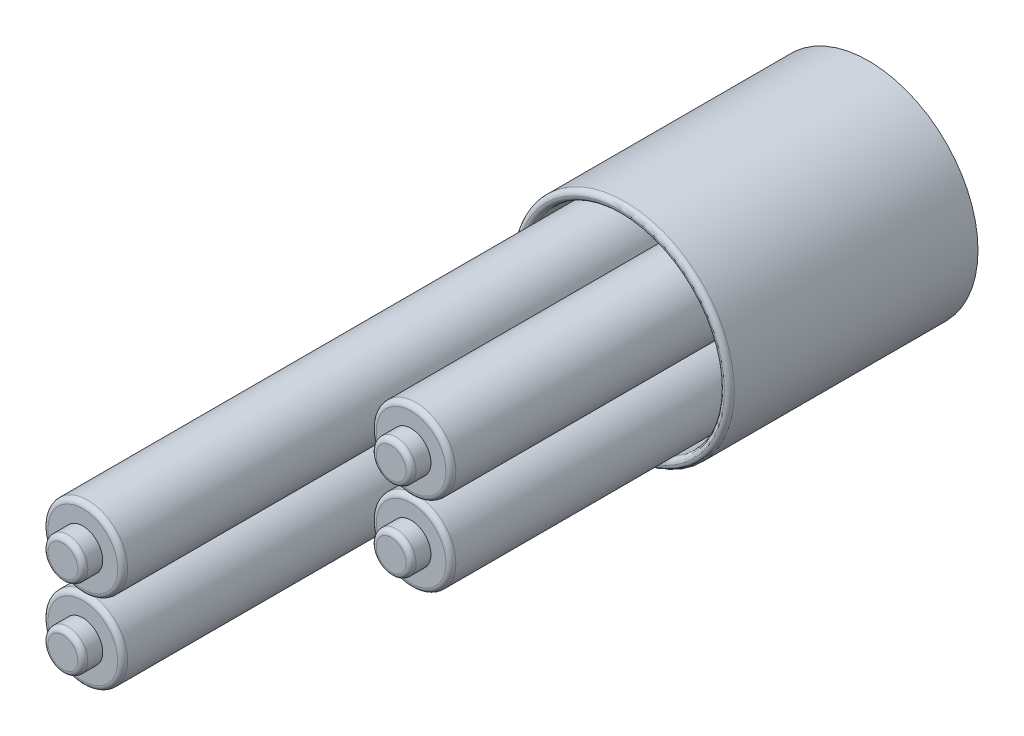
ISO-10303-21;
HEADER;
FILE_DESCRIPTION(('STEP AP214'),'2;1');
FILE_NAME('part.step','',(''),(''),'','','');
FILE_SCHEMA(('AUTOMOTIVE_DESIGN { 1 0 10303 214 1 1 1 1 }'));
ENDSEC;
DATA;
#1=APPLICATION_CONTEXT('core data for automotive mechanical design processes');
#2=APPLICATION_PROTOCOL_DEFINITION('international standard','automotive_design',2000,#1);
#3=PRODUCT_CONTEXT('',#1,'mechanical');
#4=PRODUCT('Part','Part','',(#3));
#5=PRODUCT_RELATED_PRODUCT_CATEGORY('part','',(#4));
#6=PRODUCT_DEFINITION_FORMATION('','',#4);
#7=PRODUCT_DEFINITION_CONTEXT('part definition',#1,'design');
#8=PRODUCT_DEFINITION('design','',#6,#7);
#9=PRODUCT_DEFINITION_SHAPE('','',#8);
#10=(LENGTH_UNIT() NAMED_UNIT(*) SI_UNIT(.MILLI.,.METRE.));
#11=(NAMED_UNIT(*) PLANE_ANGLE_UNIT() SI_UNIT($,.RADIAN.));
#12=(NAMED_UNIT(*) SI_UNIT($,.STERADIAN.) SOLID_ANGLE_UNIT());
#13=UNCERTAINTY_MEASURE_WITH_UNIT(LENGTH_MEASURE(1.E-05),#10,'distance_accuracy_value','');
#14=(GEOMETRIC_REPRESENTATION_CONTEXT(3) GLOBAL_UNCERTAINTY_ASSIGNED_CONTEXT((#13)) GLOBAL_UNIT_ASSIGNED_CONTEXT((#10,
#11,#12)) REPRESENTATION_CONTEXT('',''));
#15=CARTESIAN_POINT('',(0.,0.,0.));
#16=DIRECTION('',(0.,0.,1.));
#17=DIRECTION('',(1.,0.,0.));
#18=AXIS2_PLACEMENT_3D('',#15,#16,#17);
#19=CARTESIAN_POINT('',(-0.1016,0.1016,1.9558));
#20=DIRECTION('',(0.,0.,-1.));
#21=DIRECTION('',(-1.,0.,0.));
#22=AXIS2_PLACEMENT_3D('',#19,#20,#21);
#23=CYLINDRICAL_SURFACE('',#22,0.0508);
#24=CARTESIAN_POINT('',(-0.1016,0.1016,1.9431));
#25=DIRECTION('',(0.,0.,1.));
#26=DIRECTION('',(1.,0.,0.));
#27=AXIS2_PLACEMENT_3D('',#24,#25,#26);
#28=CIRCLE('',#27,0.0508);
#29=CARTESIAN_POINT('',(-0.0508,0.1016,1.9431));
#30=VERTEX_POINT('',#29);
#31=EDGE_CURVE('E11',#30,#30,#28,.F.);
#32=ORIENTED_EDGE('',*,*,#31,.T.);
#33=EDGE_LOOP('',(#32));
#34=FACE_BOUND('',#33,.T.);
#35=CARTESIAN_POINT('',(-0.1016,0.1016,0.));
#36=DIRECTION('',(0.,0.,1.));
#37=DIRECTION('',(1.,0.,0.));
#38=AXIS2_PLACEMENT_3D('',#35,#36,#37);
#39=CIRCLE('',#38,0.0508);
#40=CARTESIAN_POINT('',(-0.0508,0.1016,0.));
#41=VERTEX_POINT('',#40);
#42=EDGE_CURVE('E59',#41,#41,#39,.T.);
#43=ORIENTED_EDGE('',*,*,#42,.T.);
#44=EDGE_LOOP('',(#43));
#45=FACE_BOUND('',#44,.T.);
#46=ADVANCED_FACE('F48',(#34,#45),#23,.T.);
#47=CARTESIAN_POINT('',(-0.1016,0.1016,1.9558));
#48=DIRECTION('',(0.,0.,1.));
#49=DIRECTION('',(1.,0.,0.));
#50=AXIS2_PLACEMENT_3D('',#47,#48,#49);
#51=PLANE('',#50);
#52=CARTESIAN_POINT('',(-0.1016,0.1016,1.9558));
#53=DIRECTION('',(0.,0.,1.));
#54=DIRECTION('',(1.,0.,0.));
#55=AXIS2_PLACEMENT_3D('',#52,#53,#54);
#56=CIRCLE('',#55,0.0381);
#57=CARTESIAN_POINT('',(-0.0635,0.1016,1.9558));
#58=VERTEX_POINT('',#57);
#59=EDGE_CURVE('E55',#58,#58,#56,.T.);
#60=ORIENTED_EDGE('',*,*,#59,.T.);
#61=EDGE_LOOP('',(#60));
#62=FACE_BOUND('',#61,.T.);
#63=ADVANCED_FACE('F69',(#62),#51,.T.);
#64=CARTESIAN_POINT('',(-0.1016,0.1016,0.));
#65=DIRECTION('',(0.,0.,1.));
#66=DIRECTION('',(1.,0.,0.));
#67=AXIS2_PLACEMENT_3D('',#64,#65,#66);
#68=PLANE('',#67);
#69=ORIENTED_EDGE('',*,*,#42,.F.);
#70=EDGE_LOOP('',(#69));
#71=FACE_BOUND('',#70,.T.);
#72=ADVANCED_FACE('F67',(#71),#68,.F.);
#73=CARTESIAN_POINT('',(-0.1016,0.1016,1.9431));
#74=DIRECTION('',(0.,0.,1.));
#75=DIRECTION('',(1.,0.,0.));
#76=AXIS2_PLACEMENT_3D('',#73,#74,#75);
#77=TOROIDAL_SURFACE('',#76,0.0381,0.0127);
#78=ORIENTED_EDGE('',*,*,#31,.F.);
#79=EDGE_LOOP('',(#78));
#80=FACE_BOUND('',#79,.T.);
#81=ORIENTED_EDGE('',*,*,#59,.F.);
#82=EDGE_LOOP('',(#81));
#83=FACE_BOUND('',#82,.T.);
#84=ADVANCED_FACE('F50',(#80,#83),#77,.T.);
#85=CLOSED_SHELL('',(#46,#63,#72,#84));
#86=MANIFOLD_SOLID_BREP('B2',#85);
#87=CARTESIAN_POINT('',(-0.1016,-0.1016,1.9558));
#88=DIRECTION('',(0.,0.,-1.));
#89=DIRECTION('',(-1.,0.,0.));
#90=AXIS2_PLACEMENT_3D('',#87,#88,#89);
#91=CYLINDRICAL_SURFACE('',#90,0.0508);
#92=CARTESIAN_POINT('',(-0.1016,-0.1016,1.9431));
#93=DIRECTION('',(0.,0.,1.));
#94=DIRECTION('',(1.,0.,0.));
#95=AXIS2_PLACEMENT_3D('',#92,#93,#94);
#96=CIRCLE('',#95,0.0508);
#97=CARTESIAN_POINT('',(-0.0507999999999999,-0.1016,1.9431));
#98=VERTEX_POINT('',#97);
#99=EDGE_CURVE('E47',#98,#98,#96,.F.);
#100=ORIENTED_EDGE('',*,*,#99,.T.);
#101=EDGE_LOOP('',(#100));
#102=FACE_BOUND('',#101,.T.);
#103=CARTESIAN_POINT('',(-0.1016,-0.1016,0.));
#104=DIRECTION('',(0.,0.,1.));
#105=DIRECTION('',(1.,0.,0.));
#106=AXIS2_PLACEMENT_3D('',#103,#104,#105);
#107=CIRCLE('',#106,0.0508);
#108=CARTESIAN_POINT('',(-0.0507999999999999,-0.1016,0.));
#109=VERTEX_POINT('',#108);
#110=EDGE_CURVE('E123',#109,#109,#107,.T.);
#111=ORIENTED_EDGE('',*,*,#110,.T.);
#112=EDGE_LOOP('',(#111));
#113=FACE_BOUND('',#112,.T.);
#114=ADVANCED_FACE('F112',(#102,#113),#91,.T.);
#115=CARTESIAN_POINT('',(0.,0.,1.9558));
#116=DIRECTION('',(0.,0.,1.));
#117=DIRECTION('',(1.,0.,0.));
#118=AXIS2_PLACEMENT_3D('',#115,#116,#117);
#119=PLANE('',#118);
#120=CARTESIAN_POINT('',(-0.1016,-0.1016,1.9558));
#121=DIRECTION('',(0.,0.,1.));
#122=DIRECTION('',(1.,0.,0.));
#123=AXIS2_PLACEMENT_3D('',#120,#121,#122);
#124=CIRCLE('',#123,0.0381);
#125=CARTESIAN_POINT('',(-0.0634999999999999,-0.1016,1.9558));
#126=VERTEX_POINT('',#125);
#127=EDGE_CURVE('E119',#126,#126,#124,.T.);
#128=ORIENTED_EDGE('',*,*,#127,.T.);
#129=EDGE_LOOP('',(#128));
#130=FACE_BOUND('',#129,.T.);
#131=ADVANCED_FACE('F133',(#130),#119,.T.);
#132=CARTESIAN_POINT('',(0.,0.,0.));
#133=DIRECTION('',(0.,0.,1.));
#134=DIRECTION('',(1.,0.,0.));
#135=AXIS2_PLACEMENT_3D('',#132,#133,#134);
#136=PLANE('',#135);
#137=ORIENTED_EDGE('',*,*,#110,.F.);
#138=EDGE_LOOP('',(#137));
#139=FACE_BOUND('',#138,.T.);
#140=ADVANCED_FACE('F131',(#139),#136,.F.);
#141=CARTESIAN_POINT('',(-0.1016,-0.1016,1.9431));
#142=DIRECTION('',(0.,0.,1.));
#143=DIRECTION('',(1.,0.,0.));
#144=AXIS2_PLACEMENT_3D('',#141,#142,#143);
#145=TOROIDAL_SURFACE('',#144,0.0381,0.0127);
#146=ORIENTED_EDGE('',*,*,#99,.F.);
#147=EDGE_LOOP('',(#146));
#148=FACE_BOUND('',#147,.T.);
#149=ORIENTED_EDGE('',*,*,#127,.F.);
#150=EDGE_LOOP('',(#149));
#151=FACE_BOUND('',#150,.T.);
#152=ADVANCED_FACE('F114',(#148,#151),#145,.T.);
#153=CLOSED_SHELL('',(#114,#131,#140,#152));
#154=MANIFOLD_SOLID_BREP('B6',#153);
#155=CARTESIAN_POINT('',(0.1016,-0.1016,1.3208));
#156=DIRECTION('',(0.,0.,-1.));
#157=DIRECTION('',(-1.,0.,0.));
#158=AXIS2_PLACEMENT_3D('',#155,#156,#157);
#159=CYLINDRICAL_SURFACE('',#158,0.0508);
#160=CARTESIAN_POINT('',(0.1016,-0.1016,1.3081));
#161=DIRECTION('',(0.,0.,1.));
#162=DIRECTION('',(1.,0.,0.));
#163=AXIS2_PLACEMENT_3D('',#160,#161,#162);
#164=CIRCLE('',#163,0.0508);
#165=CARTESIAN_POINT('',(0.1524,-0.1016,1.3081));
#166=VERTEX_POINT('',#165);
#167=EDGE_CURVE('E111',#166,#166,#164,.F.);
#168=ORIENTED_EDGE('',*,*,#167,.T.);
#169=EDGE_LOOP('',(#168));
#170=FACE_BOUND('',#169,.T.);
#171=CARTESIAN_POINT('',(0.1016,-0.1016,0.));
#172=DIRECTION('',(0.,0.,1.));
#173=DIRECTION('',(1.,0.,0.));
#174=AXIS2_PLACEMENT_3D('',#171,#172,#173);
#175=CIRCLE('',#174,0.0508);
#176=CARTESIAN_POINT('',(0.1524,-0.1016,0.));
#177=VERTEX_POINT('',#176);
#178=EDGE_CURVE('E187',#177,#177,#175,.T.);
#179=ORIENTED_EDGE('',*,*,#178,.T.);
#180=EDGE_LOOP('',(#179));
#181=FACE_BOUND('',#180,.T.);
#182=ADVANCED_FACE('F176',(#170,#181),#159,.T.);
#183=CARTESIAN_POINT('',(0.,0.,1.3208));
#184=DIRECTION('',(0.,0.,1.));
#185=DIRECTION('',(1.,0.,0.));
#186=AXIS2_PLACEMENT_3D('',#183,#184,#185);
#187=PLANE('',#186);
#188=CARTESIAN_POINT('',(0.1016,-0.1016,1.3208));
#189=DIRECTION('',(0.,0.,1.));
#190=DIRECTION('',(1.,0.,0.));
#191=AXIS2_PLACEMENT_3D('',#188,#189,#190);
#192=CIRCLE('',#191,0.0381);
#193=CARTESIAN_POINT('',(0.1397,-0.1016,1.3208));
#194=VERTEX_POINT('',#193);
#195=EDGE_CURVE('E183',#194,#194,#192,.T.);
#196=ORIENTED_EDGE('',*,*,#195,.T.);
#197=EDGE_LOOP('',(#196));
#198=FACE_BOUND('',#197,.T.);
#199=ADVANCED_FACE('F197',(#198),#187,.T.);
#200=CARTESIAN_POINT('',(0.,0.,0.));
#201=DIRECTION('',(0.,0.,1.));
#202=DIRECTION('',(1.,0.,0.));
#203=AXIS2_PLACEMENT_3D('',#200,#201,#202);
#204=PLANE('',#203);
#205=ORIENTED_EDGE('',*,*,#178,.F.);
#206=EDGE_LOOP('',(#205));
#207=FACE_BOUND('',#206,.T.);
#208=ADVANCED_FACE('F195',(#207),#204,.F.);
#209=CARTESIAN_POINT('',(0.1016,-0.1016,1.3081));
#210=DIRECTION('',(0.,0.,1.));
#211=DIRECTION('',(1.,0.,0.));
#212=AXIS2_PLACEMENT_3D('',#209,#210,#211);
#213=TOROIDAL_SURFACE('',#212,0.0381,0.0127);
#214=ORIENTED_EDGE('',*,*,#167,.F.);
#215=EDGE_LOOP('',(#214));
#216=FACE_BOUND('',#215,.T.);
#217=ORIENTED_EDGE('',*,*,#195,.F.);
#218=EDGE_LOOP('',(#217));
#219=FACE_BOUND('',#218,.T.);
#220=ADVANCED_FACE('F178',(#216,#219),#213,.T.);
#221=CLOSED_SHELL('',(#182,#199,#208,#220));
#222=MANIFOLD_SOLID_BREP('B42',#221);
#223=CARTESIAN_POINT('',(0.1016,0.1016,1.3208));
#224=DIRECTION('',(0.,0.,-1.));
#225=DIRECTION('',(-1.,0.,0.));
#226=AXIS2_PLACEMENT_3D('',#223,#224,#225);
#227=CYLINDRICAL_SURFACE('',#226,0.0508);
#228=CARTESIAN_POINT('',(0.1016,0.1016,1.3081));
#229=DIRECTION('',(0.,0.,1.));
#230=DIRECTION('',(1.,0.,0.));
#231=AXIS2_PLACEMENT_3D('',#228,#229,#230);
#232=CIRCLE('',#231,0.0508);
#233=CARTESIAN_POINT('',(0.1524,0.1016,1.3081));
#234=VERTEX_POINT('',#233);
#235=EDGE_CURVE('E175',#234,#234,#232,.F.);
#236=ORIENTED_EDGE('',*,*,#235,.T.);
#237=EDGE_LOOP('',(#236));
#238=FACE_BOUND('',#237,.T.);
#239=CARTESIAN_POINT('',(0.1016,0.1016,0.));
#240=DIRECTION('',(0.,0.,1.));
#241=DIRECTION('',(1.,0.,0.));
#242=AXIS2_PLACEMENT_3D('',#239,#240,#241);
#243=CIRCLE('',#242,0.0508);
#244=CARTESIAN_POINT('',(0.1524,0.1016,0.));
#245=VERTEX_POINT('',#244);
#246=EDGE_CURVE('E251',#245,#245,#243,.T.);
#247=ORIENTED_EDGE('',*,*,#246,.T.);
#248=EDGE_LOOP('',(#247));
#249=FACE_BOUND('',#248,.T.);
#250=ADVANCED_FACE('F240',(#238,#249),#227,.T.);
#251=CARTESIAN_POINT('',(0.,0.,1.3208));
#252=DIRECTION('',(0.,0.,1.));
#253=DIRECTION('',(1.,0.,0.));
#254=AXIS2_PLACEMENT_3D('',#251,#252,#253);
#255=PLANE('',#254);
#256=CARTESIAN_POINT('',(0.1016,0.1016,1.3208));
#257=DIRECTION('',(0.,0.,1.));
#258=DIRECTION('',(1.,0.,0.));
#259=AXIS2_PLACEMENT_3D('',#256,#257,#258);
#260=CIRCLE('',#259,0.0381);
#261=CARTESIAN_POINT('',(0.1397,0.1016,1.3208));
#262=VERTEX_POINT('',#261);
#263=EDGE_CURVE('E247',#262,#262,#260,.T.);
#264=ORIENTED_EDGE('',*,*,#263,.T.);
#265=EDGE_LOOP('',(#264));
#266=FACE_BOUND('',#265,.T.);
#267=ADVANCED_FACE('F261',(#266),#255,.T.);
#268=CARTESIAN_POINT('',(0.,0.,0.));
#269=DIRECTION('',(0.,0.,1.));
#270=DIRECTION('',(1.,0.,0.));
#271=AXIS2_PLACEMENT_3D('',#268,#269,#270);
#272=PLANE('',#271);
#273=ORIENTED_EDGE('',*,*,#246,.F.);
#274=EDGE_LOOP('',(#273));
#275=FACE_BOUND('',#274,.T.);
#276=ADVANCED_FACE('F259',(#275),#272,.F.);
#277=CARTESIAN_POINT('',(0.1016,0.1016,1.3081));
#278=DIRECTION('',(0.,0.,1.));
#279=DIRECTION('',(1.,0.,0.));
#280=AXIS2_PLACEMENT_3D('',#277,#278,#279);
#281=TOROIDAL_SURFACE('',#280,0.0381,0.0127);
#282=ORIENTED_EDGE('',*,*,#235,.F.);
#283=EDGE_LOOP('',(#282));
#284=FACE_BOUND('',#283,.T.);
#285=ORIENTED_EDGE('',*,*,#263,.F.);
#286=EDGE_LOOP('',(#285));
#287=FACE_BOUND('',#286,.T.);
#288=ADVANCED_FACE('F242',(#284,#287),#281,.T.);
#289=CLOSED_SHELL('',(#250,#267,#276,#288));
#290=MANIFOLD_SOLID_BREP('B106',#289);
#291=CARTESIAN_POINT('',(-0.1016,0.1016,1.905));
#292=DIRECTION('',(0.,0.,-1.));
#293=DIRECTION('',(-1.,0.,0.));
#294=AXIS2_PLACEMENT_3D('',#291,#292,#293);
#295=CYLINDRICAL_SURFACE('',#294,0.0508);
#296=CARTESIAN_POINT('',(-0.1016,0.1016,1.905));
#297=DIRECTION('',(0.,0.,1.));
#298=DIRECTION('',(1.,0.,0.));
#299=AXIS2_PLACEMENT_3D('',#296,#297,#298);
#300=CIRCLE('',#299,0.0508);
#301=CARTESIAN_POINT('',(-0.0508,0.1016,1.905));
#302=VERTEX_POINT('',#301);
#303=EDGE_CURVE('E315',#302,#302,#300,.T.);
#304=ORIENTED_EDGE('',*,*,#303,.T.);
#305=EDGE_LOOP('',(#304));
#306=FACE_BOUND('',#305,.T.);
#307=CARTESIAN_POINT('',(-0.1016,0.1016,0.));
#308=DIRECTION('',(0.,0.,1.));
#309=DIRECTION('',(1.,0.,0.));
#310=AXIS2_PLACEMENT_3D('',#307,#308,#309);
#311=CIRCLE('',#310,0.0508);
#312=CARTESIAN_POINT('',(-0.0508,0.1016,0.));
#313=VERTEX_POINT('',#312);
#314=EDGE_CURVE('E324',#313,#313,#311,.T.);
#315=ORIENTED_EDGE('',*,*,#314,.F.);
#316=EDGE_LOOP('',(#315));
#317=FACE_BOUND('',#316,.T.);
#318=ADVANCED_FACE('F304',(#306,#317),#295,.F.);
#319=CARTESIAN_POINT('',(-0.1016,0.1016,1.905));
#320=DIRECTION('',(0.,0.,-1.));
#321=DIRECTION('',(-1.,0.,0.));
#322=AXIS2_PLACEMENT_3D('',#319,#320,#321);
#323=CYLINDRICAL_SURFACE('',#322,0.1016);
#324=CARTESIAN_POINT('',(-0.1016,0.1016,1.8923));
#325=DIRECTION('',(0.,0.,1.));
#326=DIRECTION('',(1.,0.,0.));
#327=AXIS2_PLACEMENT_3D('',#324,#325,#326);
#328=CIRCLE('',#327,0.1016);
#329=CARTESIAN_POINT('',(0.,0.1016,1.8923));
#330=VERTEX_POINT('',#329);
#331=EDGE_CURVE('E239',#330,#330,#328,.F.);
#332=ORIENTED_EDGE('',*,*,#331,.T.);
#333=EDGE_LOOP('',(#332));
#334=FACE_BOUND('',#333,.T.);
#335=CARTESIAN_POINT('',(-0.1016,0.1016,0.));
#336=DIRECTION('',(0.,0.,1.));
#337=DIRECTION('',(1.,0.,0.));
#338=AXIS2_PLACEMENT_3D('',#335,#336,#337);
#339=CIRCLE('',#338,0.1016);
#340=CARTESIAN_POINT('',(0.,0.1016,0.));
#341=VERTEX_POINT('',#340);
#342=EDGE_CURVE('E319',#341,#341,#339,.T.);
#343=ORIENTED_EDGE('',*,*,#342,.T.);
#344=EDGE_LOOP('',(#343));
#345=FACE_BOUND('',#344,.T.);
#346=ADVANCED_FACE('F332',(#334,#345),#323,.T.);
#347=CARTESIAN_POINT('',(0.,0.,1.905));
#348=DIRECTION('',(0.,0.,1.));
#349=DIRECTION('',(1.,0.,0.));
#350=AXIS2_PLACEMENT_3D('',#347,#348,#349);
#351=PLANE('',#350);
#352=CARTESIAN_POINT('',(-0.1016,0.1016,1.905));
#353=DIRECTION('',(0.,0.,1.));
#354=DIRECTION('',(1.,0.,0.));
#355=AXIS2_PLACEMENT_3D('',#352,#353,#354);
#356=CIRCLE('',#355,0.0889);
#357=CARTESIAN_POINT('',(-0.0127,0.1016,1.905));
#358=VERTEX_POINT('',#357);
#359=EDGE_CURVE('E311',#358,#358,#356,.T.);
#360=ORIENTED_EDGE('',*,*,#359,.T.);
#361=EDGE_LOOP('',(#360));
#362=FACE_BOUND('',#361,.T.);
#363=ORIENTED_EDGE('',*,*,#303,.F.);
#364=EDGE_LOOP('',(#363));
#365=FACE_BOUND('',#364,.T.);
#366=ADVANCED_FACE('F337',(#362,#365),#351,.T.);
#367=CARTESIAN_POINT('',(0.,0.,0.));
#368=DIRECTION('',(0.,0.,1.));
#369=DIRECTION('',(1.,0.,0.));
#370=AXIS2_PLACEMENT_3D('',#367,#368,#369);
#371=PLANE('',#370);
#372=ORIENTED_EDGE('',*,*,#314,.T.);
#373=EDGE_LOOP('',(#372));
#374=FACE_BOUND('',#373,.T.);
#375=ORIENTED_EDGE('',*,*,#342,.F.);
#376=EDGE_LOOP('',(#375));
#377=FACE_BOUND('',#376,.T.);
#378=ADVANCED_FACE('F328',(#374,#377),#371,.F.);
#379=CARTESIAN_POINT('',(-0.1016,0.1016,1.8923));
#380=DIRECTION('',(0.,0.,1.));
#381=DIRECTION('',(1.,0.,0.));
#382=AXIS2_PLACEMENT_3D('',#379,#380,#381);
#383=TOROIDAL_SURFACE('',#382,0.0889,0.0127);
#384=ORIENTED_EDGE('',*,*,#331,.F.);
#385=EDGE_LOOP('',(#384));
#386=FACE_BOUND('',#385,.T.);
#387=ORIENTED_EDGE('',*,*,#359,.F.);
#388=EDGE_LOOP('',(#387));
#389=FACE_BOUND('',#388,.T.);
#390=ADVANCED_FACE('F306',(#386,#389),#383,.T.);
#391=CLOSED_SHELL('',(#318,#346,#366,#378,#390));
#392=MANIFOLD_SOLID_BREP('B170',#391);
#393=CARTESIAN_POINT('',(0.,0.,0.635));
#394=DIRECTION('',(0.,0.,-1.));
#395=DIRECTION('',(-1.,0.,0.));
#396=AXIS2_PLACEMENT_3D('',#393,#394,#395);
#397=CYLINDRICAL_SURFACE('',#396,0.254);
#398=CARTESIAN_POINT('',(0.,0.,0.6223));
#399=DIRECTION('',(0.,0.,1.));
#400=DIRECTION('',(1.,0.,0.));
#401=AXIS2_PLACEMENT_3D('',#398,#399,#400);
#402=CIRCLE('',#401,0.254);
#403=CARTESIAN_POINT('',(0.254,0.,0.6223));
#404=VERTEX_POINT('',#403);
#405=EDGE_CURVE('E303',#404,#404,#402,.T.);
#406=ORIENTED_EDGE('',*,*,#405,.T.);
#407=EDGE_LOOP('',(#406));
#408=FACE_BOUND('',#407,.T.);
#409=CARTESIAN_POINT('',(0.,0.,0.));
#410=DIRECTION('',(0.,0.,1.));
#411=DIRECTION('',(1.,0.,0.));
#412=AXIS2_PLACEMENT_3D('',#409,#410,#411);
#413=CIRCLE('',#412,0.254);
#414=CARTESIAN_POINT('',(0.254,0.,0.));
#415=VERTEX_POINT('',#414);
#416=EDGE_CURVE('E406',#415,#415,#413,.T.);
#417=ORIENTED_EDGE('',*,*,#416,.F.);
#418=EDGE_LOOP('',(#417));
#419=FACE_BOUND('',#418,.T.);
#420=ADVANCED_FACE('F389',(#408,#419),#397,.F.);
#421=CARTESIAN_POINT('',(0.,0.,0.635));
#422=DIRECTION('',(0.,0.,-1.));
#423=DIRECTION('',(-1.,0.,0.));
#424=AXIS2_PLACEMENT_3D('',#421,#422,#423);
#425=CYLINDRICAL_SURFACE('',#424,0.2794);
#426=CARTESIAN_POINT('',(0.,0.,0.6223));
#427=DIRECTION('',(0.,0.,1.));
#428=DIRECTION('',(1.,0.,0.));
#429=AXIS2_PLACEMENT_3D('',#426,#427,#428);
#430=CIRCLE('',#429,0.2794);
#431=CARTESIAN_POINT('',(0.2794,0.,0.6223));
#432=VERTEX_POINT('',#431);
#433=EDGE_CURVE('E397',#432,#432,#430,.F.);
#434=ORIENTED_EDGE('',*,*,#433,.T.);
#435=EDGE_LOOP('',(#434));
#436=FACE_BOUND('',#435,.T.);
#437=CARTESIAN_POINT('',(0.,0.,0.));
#438=DIRECTION('',(0.,0.,1.));
#439=DIRECTION('',(1.,0.,0.));
#440=AXIS2_PLACEMENT_3D('',#437,#438,#439);
#441=CIRCLE('',#440,0.2794);
#442=CARTESIAN_POINT('',(0.2794,0.,0.));
#443=VERTEX_POINT('',#442);
#444=EDGE_CURVE('E401',#443,#443,#441,.T.);
#445=ORIENTED_EDGE('',*,*,#444,.T.);
#446=EDGE_LOOP('',(#445));
#447=FACE_BOUND('',#446,.T.);
#448=ADVANCED_FACE('F423',(#436,#447),#425,.T.);
#449=CARTESIAN_POINT('',(0.,0.,0.));
#450=DIRECTION('',(0.,0.,1.));
#451=DIRECTION('',(1.,0.,0.));
#452=AXIS2_PLACEMENT_3D('',#449,#450,#451);
#453=PLANE('',#452);
#454=ORIENTED_EDGE('',*,*,#416,.T.);
#455=EDGE_LOOP('',(#454));
#456=FACE_BOUND('',#455,.T.);
#457=ORIENTED_EDGE('',*,*,#444,.F.);
#458=EDGE_LOOP('',(#457));
#459=FACE_BOUND('',#458,.T.);
#460=ADVANCED_FACE('F416',(#456,#459),#453,.F.);
#461=CARTESIAN_POINT('',(0.,0.,0.6223));
#462=DIRECTION('',(0.,0.,1.));
#463=DIRECTION('',(1.,0.,0.));
#464=AXIS2_PLACEMENT_3D('',#461,#462,#463);
#465=TOROIDAL_SURFACE('',#464,0.2667,0.0127);
#466=ORIENTED_EDGE('',*,*,#405,.F.);
#467=EDGE_LOOP('',(#466));
#468=FACE_BOUND('',#467,.T.);
#469=CARTESIAN_POINT('',(0.,0.,0.635));
#470=DIRECTION('',(0.,0.,1.));
#471=DIRECTION('',(1.,0.,0.));
#472=AXIS2_PLACEMENT_3D('',#469,#470,#471);
#473=CIRCLE('',#472,0.2667);
#474=CARTESIAN_POINT('',(0.2667,0.,0.635));
#475=VERTEX_POINT('',#474);
#476=EDGE_CURVE('E393',#475,#475,#473,.F.);
#477=ORIENTED_EDGE('',*,*,#476,.F.);
#478=EDGE_LOOP('',(#477));
#479=FACE_BOUND('',#478,.T.);
#480=ADVANCED_FACE('F391',(#468,#479),#465,.T.);
#481=CARTESIAN_POINT('',(0.,0.,0.6223));
#482=DIRECTION('',(0.,0.,1.));
#483=DIRECTION('',(1.,0.,0.));
#484=AXIS2_PLACEMENT_3D('',#481,#482,#483);
#485=TOROIDAL_SURFACE('',#484,0.2667,0.0127);
#486=ORIENTED_EDGE('',*,*,#433,.F.);
#487=EDGE_LOOP('',(#486));
#488=FACE_BOUND('',#487,.T.);
#489=ORIENTED_EDGE('',*,*,#476,.T.);
#490=EDGE_LOOP('',(#489));
#491=FACE_BOUND('',#490,.T.);
#492=ADVANCED_FACE('F413',(#488,#491),#485,.T.);
#493=CLOSED_SHELL('',(#420,#448,#460,#480,#492));
#494=MANIFOLD_SOLID_BREP('B234',#493);
#495=CARTESIAN_POINT('',(0.1016,-0.1016,1.27));
#496=DIRECTION('',(0.,0.,-1.));
#497=DIRECTION('',(-1.,0.,0.));
#498=AXIS2_PLACEMENT_3D('',#495,#496,#497);
#499=CYLINDRICAL_SURFACE('',#498,0.0508);
#500=CARTESIAN_POINT('',(0.1016,-0.1016,1.27));
#501=DIRECTION('',(0.,0.,1.));
#502=DIRECTION('',(1.,0.,0.));
#503=AXIS2_PLACEMENT_3D('',#500,#501,#502);
#504=CIRCLE('',#503,0.0508);
#505=CARTESIAN_POINT('',(0.1524,-0.1016,1.27));
#506=VERTEX_POINT('',#505);
#507=EDGE_CURVE('E487',#506,#506,#504,.T.);
#508=ORIENTED_EDGE('',*,*,#507,.T.);
#509=EDGE_LOOP('',(#508));
#510=FACE_BOUND('',#509,.T.);
#511=CARTESIAN_POINT('',(0.1016,-0.1016,0.));
#512=DIRECTION('',(0.,0.,1.));
#513=DIRECTION('',(1.,0.,0.));
#514=AXIS2_PLACEMENT_3D('',#511,#512,#513);
#515=CIRCLE('',#514,0.0508);
#516=CARTESIAN_POINT('',(0.1524,-0.1016,0.));
#517=VERTEX_POINT('',#516);
#518=EDGE_CURVE('E496',#517,#517,#515,.T.);
#519=ORIENTED_EDGE('',*,*,#518,.F.);
#520=EDGE_LOOP('',(#519));
#521=FACE_BOUND('',#520,.T.);
#522=ADVANCED_FACE('F476',(#510,#521),#499,.F.);
#523=CARTESIAN_POINT('',(0.1016,-0.1016,1.27));
#524=DIRECTION('',(0.,0.,-1.));
#525=DIRECTION('',(-1.,0.,0.));
#526=AXIS2_PLACEMENT_3D('',#523,#524,#525);
#527=CYLINDRICAL_SURFACE('',#526,0.1016);
#528=CARTESIAN_POINT('',(0.1016,-0.1016,1.2573));
#529=DIRECTION('',(0.,0.,1.));
#530=DIRECTION('',(1.,0.,0.));
#531=AXIS2_PLACEMENT_3D('',#528,#529,#530);
#532=CIRCLE('',#531,0.1016);
#533=CARTESIAN_POINT('',(0.2032,-0.1016,1.2573));
#534=VERTEX_POINT('',#533);
#535=EDGE_CURVE('E388',#534,#534,#532,.F.);
#536=ORIENTED_EDGE('',*,*,#535,.T.);
#537=EDGE_LOOP('',(#536));
#538=FACE_BOUND('',#537,.T.);
#539=CARTESIAN_POINT('',(0.1016,-0.1016,0.));
#540=DIRECTION('',(0.,0.,1.));
#541=DIRECTION('',(1.,0.,0.));
#542=AXIS2_PLACEMENT_3D('',#539,#540,#541);
#543=CIRCLE('',#542,0.1016);
#544=CARTESIAN_POINT('',(0.2032,-0.1016,0.));
#545=VERTEX_POINT('',#544);
#546=EDGE_CURVE('E491',#545,#545,#543,.T.);
#547=ORIENTED_EDGE('',*,*,#546,.T.);
#548=EDGE_LOOP('',(#547));
#549=FACE_BOUND('',#548,.T.);
#550=ADVANCED_FACE('F504',(#538,#549),#527,.T.);
#551=CARTESIAN_POINT('',(0.,0.,1.27));
#552=DIRECTION('',(0.,0.,1.));
#553=DIRECTION('',(1.,0.,0.));
#554=AXIS2_PLACEMENT_3D('',#551,#552,#553);
#555=PLANE('',#554);
#556=CARTESIAN_POINT('',(0.1016,-0.1016,1.27));
#557=DIRECTION('',(0.,0.,1.));
#558=DIRECTION('',(1.,0.,0.));
#559=AXIS2_PLACEMENT_3D('',#556,#557,#558);
#560=CIRCLE('',#559,0.0889);
#561=CARTESIAN_POINT('',(0.1905,-0.1016,1.27));
#562=VERTEX_POINT('',#561);
#563=EDGE_CURVE('E483',#562,#562,#560,.T.);
#564=ORIENTED_EDGE('',*,*,#563,.T.);
#565=EDGE_LOOP('',(#564));
#566=FACE_BOUND('',#565,.T.);
#567=ORIENTED_EDGE('',*,*,#507,.F.);
#568=EDGE_LOOP('',(#567));
#569=FACE_BOUND('',#568,.T.);
#570=ADVANCED_FACE('F509',(#566,#569),#555,.T.);
#571=CARTESIAN_POINT('',(0.,0.,0.));
#572=DIRECTION('',(0.,0.,1.));
#573=DIRECTION('',(1.,0.,0.));
#574=AXIS2_PLACEMENT_3D('',#571,#572,#573);
#575=PLANE('',#574);
#576=ORIENTED_EDGE('',*,*,#518,.T.);
#577=EDGE_LOOP('',(#576));
#578=FACE_BOUND('',#577,.T.);
#579=ORIENTED_EDGE('',*,*,#546,.F.);
#580=EDGE_LOOP('',(#579));
#581=FACE_BOUND('',#580,.T.);
#582=ADVANCED_FACE('F500',(#578,#581),#575,.F.);
#583=CARTESIAN_POINT('',(0.1016,-0.1016,1.2573));
#584=DIRECTION('',(0.,0.,1.));
#585=DIRECTION('',(1.,0.,0.));
#586=AXIS2_PLACEMENT_3D('',#583,#584,#585);
#587=TOROIDAL_SURFACE('',#586,0.0889,0.0127);
#588=ORIENTED_EDGE('',*,*,#535,.F.);
#589=EDGE_LOOP('',(#588));
#590=FACE_BOUND('',#589,.T.);
#591=ORIENTED_EDGE('',*,*,#563,.F.);
#592=EDGE_LOOP('',(#591));
#593=FACE_BOUND('',#592,.T.);
#594=ADVANCED_FACE('F478',(#590,#593),#587,.T.);
#595=CLOSED_SHELL('',(#522,#550,#570,#582,#594));
#596=MANIFOLD_SOLID_BREP('B298',#595);
#597=CARTESIAN_POINT('',(0.1016,0.1016,1.27));
#598=DIRECTION('',(0.,0.,-1.));
#599=DIRECTION('',(-1.,0.,0.));
#600=AXIS2_PLACEMENT_3D('',#597,#598,#599);
#601=CYLINDRICAL_SURFACE('',#600,0.0508);
#602=CARTESIAN_POINT('',(0.1016,0.1016,1.27));
#603=DIRECTION('',(0.,0.,1.));
#604=DIRECTION('',(1.,0.,0.));
#605=AXIS2_PLACEMENT_3D('',#602,#603,#604);
#606=CIRCLE('',#605,0.0508);
#607=CARTESIAN_POINT('',(0.1524,0.1016,1.27));
#608=VERTEX_POINT('',#607);
#609=EDGE_CURVE('E576',#608,#608,#606,.T.);
#610=ORIENTED_EDGE('',*,*,#609,.T.);
#611=EDGE_LOOP('',(#610));
#612=FACE_BOUND('',#611,.T.);
#613=CARTESIAN_POINT('',(0.1016,0.1016,0.));
#614=DIRECTION('',(0.,0.,1.));
#615=DIRECTION('',(1.,0.,0.));
#616=AXIS2_PLACEMENT_3D('',#613,#614,#615);
#617=CIRCLE('',#616,0.0508);
#618=CARTESIAN_POINT('',(0.1524,0.1016,0.));
#619=VERTEX_POINT('',#618);
#620=EDGE_CURVE('E585',#619,#619,#617,.T.);
#621=ORIENTED_EDGE('',*,*,#620,.F.);
#622=EDGE_LOOP('',(#621));
#623=FACE_BOUND('',#622,.T.);
#624=ADVANCED_FACE('F565',(#612,#623),#601,.F.);
#625=CARTESIAN_POINT('',(0.1016,0.1016,1.27));
#626=DIRECTION('',(0.,0.,-1.));
#627=DIRECTION('',(-1.,0.,0.));
#628=AXIS2_PLACEMENT_3D('',#625,#626,#627);
#629=CYLINDRICAL_SURFACE('',#628,0.1016);
#630=CARTESIAN_POINT('',(0.1016,0.1016,1.2573));
#631=DIRECTION('',(0.,0.,1.));
#632=DIRECTION('',(1.,0.,0.));
#633=AXIS2_PLACEMENT_3D('',#630,#631,#632);
#634=CIRCLE('',#633,0.1016);
#635=CARTESIAN_POINT('',(0.2032,0.1016,1.2573));
#636=VERTEX_POINT('',#635);
#637=EDGE_CURVE('E475',#636,#636,#634,.F.);
#638=ORIENTED_EDGE('',*,*,#637,.T.);
#639=EDGE_LOOP('',(#638));
#640=FACE_BOUND('',#639,.T.);
#641=CARTESIAN_POINT('',(0.1016,0.1016,0.));
#642=DIRECTION('',(0.,0.,1.));
#643=DIRECTION('',(1.,0.,0.));
#644=AXIS2_PLACEMENT_3D('',#641,#642,#643);
#645=CIRCLE('',#644,0.1016);
#646=CARTESIAN_POINT('',(0.2032,0.1016,0.));
#647=VERTEX_POINT('',#646);
#648=EDGE_CURVE('E580',#647,#647,#645,.T.);
#649=ORIENTED_EDGE('',*,*,#648,.T.);
#650=EDGE_LOOP('',(#649));
#651=FACE_BOUND('',#650,.T.);
#652=ADVANCED_FACE('F593',(#640,#651),#629,.T.);
#653=CARTESIAN_POINT('',(0.,0.,1.27));
#654=DIRECTION('',(0.,0.,1.));
#655=DIRECTION('',(1.,0.,0.));
#656=AXIS2_PLACEMENT_3D('',#653,#654,#655);
#657=PLANE('',#656);
#658=CARTESIAN_POINT('',(0.1016,0.1016,1.27));
#659=DIRECTION('',(0.,0.,1.));
#660=DIRECTION('',(1.,0.,0.));
#661=AXIS2_PLACEMENT_3D('',#658,#659,#660);
#662=CIRCLE('',#661,0.0889);
#663=CARTESIAN_POINT('',(0.1905,0.1016,1.27));
#664=VERTEX_POINT('',#663);
#665=EDGE_CURVE('E572',#664,#664,#662,.T.);
#666=ORIENTED_EDGE('',*,*,#665,.T.);
#667=EDGE_LOOP('',(#666));
#668=FACE_BOUND('',#667,.T.);
#669=ORIENTED_EDGE('',*,*,#609,.F.);
#670=EDGE_LOOP('',(#669));
#671=FACE_BOUND('',#670,.T.);
#672=ADVANCED_FACE('F598',(#668,#671),#657,.T.);
#673=CARTESIAN_POINT('',(0.,0.,0.));
#674=DIRECTION('',(0.,0.,1.));
#675=DIRECTION('',(1.,0.,0.));
#676=AXIS2_PLACEMENT_3D('',#673,#674,#675);
#677=PLANE('',#676);
#678=ORIENTED_EDGE('',*,*,#620,.T.);
#679=EDGE_LOOP('',(#678));
#680=FACE_BOUND('',#679,.T.);
#681=ORIENTED_EDGE('',*,*,#648,.F.);
#682=EDGE_LOOP('',(#681));
#683=FACE_BOUND('',#682,.T.);
#684=ADVANCED_FACE('F589',(#680,#683),#677,.F.);
#685=CARTESIAN_POINT('',(0.1016,0.1016,1.2573));
#686=DIRECTION('',(0.,0.,1.));
#687=DIRECTION('',(1.,0.,0.));
#688=AXIS2_PLACEMENT_3D('',#685,#686,#687);
#689=TOROIDAL_SURFACE('',#688,0.0889,0.0127);
#690=ORIENTED_EDGE('',*,*,#637,.F.);
#691=EDGE_LOOP('',(#690));
#692=FACE_BOUND('',#691,.T.);
#693=ORIENTED_EDGE('',*,*,#665,.F.);
#694=EDGE_LOOP('',(#693));
#695=FACE_BOUND('',#694,.T.);
#696=ADVANCED_FACE('F567',(#692,#695),#689,.T.);
#697=CLOSED_SHELL('',(#624,#652,#672,#684,#696));
#698=MANIFOLD_SOLID_BREP('B383',#697);
#699=CARTESIAN_POINT('',(-0.1016,-0.1016,1.905));
#700=DIRECTION('',(0.,0.,-1.));
#701=DIRECTION('',(-1.,0.,0.));
#702=AXIS2_PLACEMENT_3D('',#699,#700,#701);
#703=CYLINDRICAL_SURFACE('',#702,0.0508);
#704=CARTESIAN_POINT('',(-0.1016,-0.1016,1.905));
#705=DIRECTION('',(0.,0.,1.));
#706=DIRECTION('',(1.,0.,0.));
#707=AXIS2_PLACEMENT_3D('',#704,#705,#706);
#708=CIRCLE('',#707,0.0508);
#709=CARTESIAN_POINT('',(-0.0507999999999999,-0.1016,1.905));
#710=VERTEX_POINT('',#709);
#711=EDGE_CURVE('E655',#710,#710,#708,.T.);
#712=ORIENTED_EDGE('',*,*,#711,.T.);
#713=EDGE_LOOP('',(#712));
#714=FACE_BOUND('',#713,.T.);
#715=CARTESIAN_POINT('',(-0.1016,-0.1016,0.));
#716=DIRECTION('',(0.,0.,1.));
#717=DIRECTION('',(1.,0.,0.));
#718=AXIS2_PLACEMENT_3D('',#715,#716,#717);
#719=CIRCLE('',#718,0.0508);
#720=CARTESIAN_POINT('',(-0.0507999999999999,-0.1016,0.));
#721=VERTEX_POINT('',#720);
#722=EDGE_CURVE('E664',#721,#721,#719,.T.);
#723=ORIENTED_EDGE('',*,*,#722,.F.);
#724=EDGE_LOOP('',(#723));
#725=FACE_BOUND('',#724,.T.);
#726=ADVANCED_FACE('F644',(#714,#725),#703,.F.);
#727=CARTESIAN_POINT('',(-0.1016,-0.1016,1.905));
#728=DIRECTION('',(0.,0.,-1.));
#729=DIRECTION('',(-1.,0.,0.));
#730=AXIS2_PLACEMENT_3D('',#727,#728,#729);
#731=CYLINDRICAL_SURFACE('',#730,0.1016);
#732=CARTESIAN_POINT('',(-0.1016,-0.1016,1.8923));
#733=DIRECTION('',(0.,0.,1.));
#734=DIRECTION('',(1.,0.,0.));
#735=AXIS2_PLACEMENT_3D('',#732,#733,#734);
#736=CIRCLE('',#735,0.1016);
#737=CARTESIAN_POINT('',(0.,-0.1016,1.8923));
#738=VERTEX_POINT('',#737);
#739=EDGE_CURVE('E564',#738,#738,#736,.F.);
#740=ORIENTED_EDGE('',*,*,#739,.T.);
#741=EDGE_LOOP('',(#740));
#742=FACE_BOUND('',#741,.T.);
#743=CARTESIAN_POINT('',(-0.1016,-0.1016,0.));
#744=DIRECTION('',(0.,0.,1.));
#745=DIRECTION('',(1.,0.,0.));
#746=AXIS2_PLACEMENT_3D('',#743,#744,#745);
#747=CIRCLE('',#746,0.1016);
#748=CARTESIAN_POINT('',(0.,-0.1016,0.));
#749=VERTEX_POINT('',#748);
#750=EDGE_CURVE('E659',#749,#749,#747,.T.);
#751=ORIENTED_EDGE('',*,*,#750,.T.);
#752=EDGE_LOOP('',(#751));
#753=FACE_BOUND('',#752,.T.);
#754=ADVANCED_FACE('F672',(#742,#753),#731,.T.);
#755=CARTESIAN_POINT('',(0.,0.,1.905));
#756=DIRECTION('',(0.,0.,1.));
#757=DIRECTION('',(1.,0.,0.));
#758=AXIS2_PLACEMENT_3D('',#755,#756,#757);
#759=PLANE('',#758);
#760=CARTESIAN_POINT('',(-0.1016,-0.1016,1.905));
#761=DIRECTION('',(0.,0.,1.));
#762=DIRECTION('',(1.,0.,0.));
#763=AXIS2_PLACEMENT_3D('',#760,#761,#762);
#764=CIRCLE('',#763,0.0889);
#765=CARTESIAN_POINT('',(-0.0126999999999999,-0.1016,1.905));
#766=VERTEX_POINT('',#765);
#767=EDGE_CURVE('E651',#766,#766,#764,.T.);
#768=ORIENTED_EDGE('',*,*,#767,.T.);
#769=EDGE_LOOP('',(#768));
#770=FACE_BOUND('',#769,.T.);
#771=ORIENTED_EDGE('',*,*,#711,.F.);
#772=EDGE_LOOP('',(#771));
#773=FACE_BOUND('',#772,.T.);
#774=ADVANCED_FACE('F677',(#770,#773),#759,.T.);
#775=CARTESIAN_POINT('',(0.,0.,0.));
#776=DIRECTION('',(0.,0.,1.));
#777=DIRECTION('',(1.,0.,0.));
#778=AXIS2_PLACEMENT_3D('',#775,#776,#777);
#779=PLANE('',#778);
#780=ORIENTED_EDGE('',*,*,#722,.T.);
#781=EDGE_LOOP('',(#780));
#782=FACE_BOUND('',#781,.T.);
#783=ORIENTED_EDGE('',*,*,#750,.F.);
#784=EDGE_LOOP('',(#783));
#785=FACE_BOUND('',#784,.T.);
#786=ADVANCED_FACE('F668',(#782,#785),#779,.F.);
#787=CARTESIAN_POINT('',(-0.1016,-0.1016,1.8923));
#788=DIRECTION('',(0.,0.,1.));
#789=DIRECTION('',(1.,0.,0.));
#790=AXIS2_PLACEMENT_3D('',#787,#788,#789);
#791=TOROIDAL_SURFACE('',#790,0.0889,0.0127);
#792=ORIENTED_EDGE('',*,*,#739,.F.);
#793=EDGE_LOOP('',(#792));
#794=FACE_BOUND('',#793,.T.);
#795=ORIENTED_EDGE('',*,*,#767,.F.);
#796=EDGE_LOOP('',(#795));
#797=FACE_BOUND('',#796,.T.);
#798=ADVANCED_FACE('F646',(#794,#797),#791,.T.);
#799=CLOSED_SHELL('',(#726,#754,#774,#786,#798));
#800=MANIFOLD_SOLID_BREP('B470',#799);
#801=ADVANCED_BREP_SHAPE_REPRESENTATION('',(#18,#86,#154,#222,#290,#392,#494,#596,#698,#800),#14);
#802=SHAPE_DEFINITION_REPRESENTATION(#9,#801);
ENDSEC;
END-ISO-10303-21;
